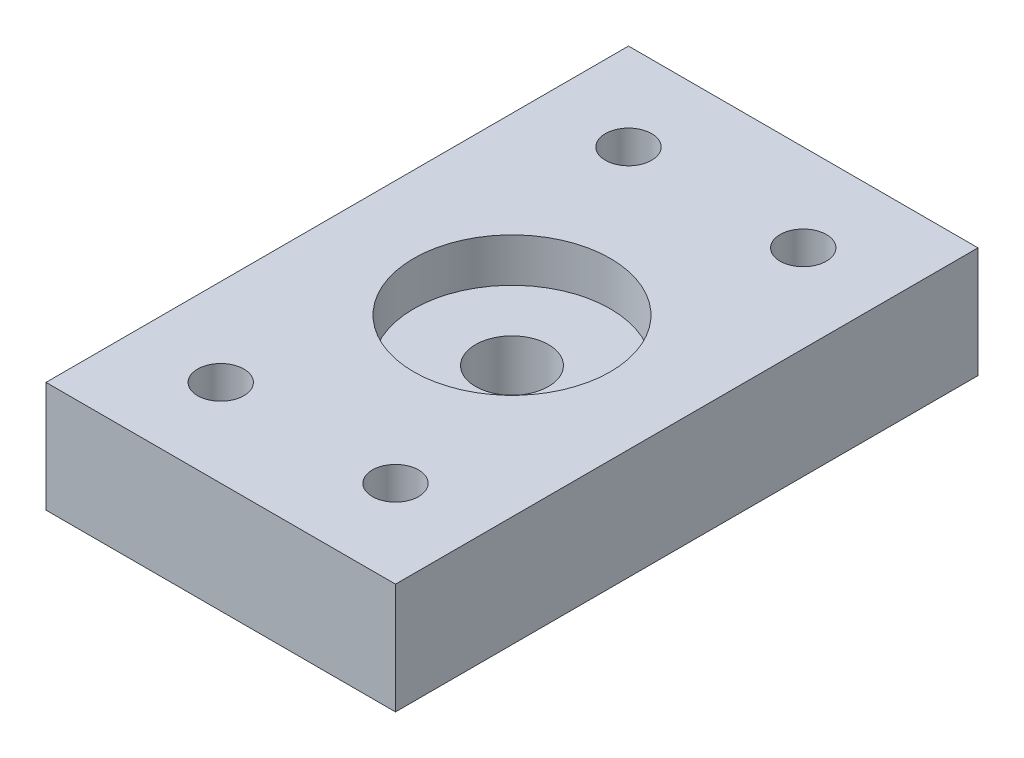
ISO-10303-21;
HEADER;
FILE_DESCRIPTION(('STEP AP214'),'2;1');
FILE_NAME('part.step','',(''),(''),'','','');
FILE_SCHEMA(('AUTOMOTIVE_DESIGN { 1 0 10303 214 1 1 1 1 }'));
ENDSEC;
DATA;
#1=APPLICATION_CONTEXT('core data for automotive mechanical design processes');
#2=APPLICATION_PROTOCOL_DEFINITION('international standard','automotive_design',2000,#1);
#3=PRODUCT_CONTEXT('',#1,'mechanical');
#4=PRODUCT('Part','Part','',(#3));
#5=PRODUCT_RELATED_PRODUCT_CATEGORY('part','',(#4));
#6=PRODUCT_DEFINITION_FORMATION('','',#4);
#7=PRODUCT_DEFINITION_CONTEXT('part definition',#1,'design');
#8=PRODUCT_DEFINITION('design','',#6,#7);
#9=PRODUCT_DEFINITION_SHAPE('','',#8);
#10=(LENGTH_UNIT() NAMED_UNIT(*) SI_UNIT(.MILLI.,.METRE.));
#11=(NAMED_UNIT(*) PLANE_ANGLE_UNIT() SI_UNIT($,.RADIAN.));
#12=(NAMED_UNIT(*) SI_UNIT($,.STERADIAN.) SOLID_ANGLE_UNIT());
#13=UNCERTAINTY_MEASURE_WITH_UNIT(LENGTH_MEASURE(1.E-05),#10,'distance_accuracy_value','');
#14=(GEOMETRIC_REPRESENTATION_CONTEXT(3) GLOBAL_UNCERTAINTY_ASSIGNED_CONTEXT((#13)) GLOBAL_UNIT_ASSIGNED_CONTEXT((#10,
#11,#12)) REPRESENTATION_CONTEXT('',''));
#15=CARTESIAN_POINT('',(0.,0.,0.));
#16=DIRECTION('',(0.,0.,1.));
#17=DIRECTION('',(1.,0.,0.));
#18=AXIS2_PLACEMENT_3D('',#15,#16,#17);
#19=CARTESIAN_POINT('',(0.,0.,0.));
#20=DIRECTION('',(0.,1.,0.));
#21=DIRECTION('',(0.,0.,1.));
#22=AXIS2_PLACEMENT_3D('',#19,#20,#21);
#23=CYLINDRICAL_SURFACE('',#22,7.9375);
#24=CARTESIAN_POINT('',(0.,0.,0.));
#25=DIRECTION('',(0.,1.,0.));
#26=DIRECTION('',(0.,0.,1.));
#27=AXIS2_PLACEMENT_3D('',#24,#25,#26);
#28=CIRCLE('',#27,7.9375);
#29=CARTESIAN_POINT('',(0.,0.,7.9375));
#30=VERTEX_POINT('',#29);
#31=EDGE_CURVE('E114',#30,#30,#28,.T.);
#32=CARTESIAN_POINT('',(0.,14.605,0.));
#33=DIRECTION('',(0.,1.,0.));
#34=DIRECTION('',(0.,0.,1.));
#35=AXIS2_PLACEMENT_3D('',#32,#33,#34);
#36=CIRCLE('',#35,7.9375);
#37=CARTESIAN_POINT('',(0.,14.605,7.9375));
#38=VERTEX_POINT('',#37);
#39=EDGE_CURVE('E43',#38,#38,#36,.F.);
#40=CARTESIAN_POINT('',(0.,0.,7.9375));
#41=CARTESIAN_POINT('',(0.,0.152135416666666,7.9375));
#42=CARTESIAN_POINT('',(0.,0.304270833333333,7.9375));
#43=CARTESIAN_POINT('',(0.,0.608541666666667,7.9375));
#44=CARTESIAN_POINT('',(0.,0.760677083333333,7.9375));
#45=CARTESIAN_POINT('',(0.,1.06494791666667,7.9375));
#46=CARTESIAN_POINT('',(0.,1.21708333333333,7.9375));
#47=CARTESIAN_POINT('',(0.,1.52135416666667,7.9375));
#48=CARTESIAN_POINT('',(0.,1.67348958333333,7.9375));
#49=CARTESIAN_POINT('',(0.,1.97776041666667,7.9375));
#50=CARTESIAN_POINT('',(0.,2.12989583333333,7.9375));
#51=CARTESIAN_POINT('',(0.,2.43416666666667,7.9375));
#52=CARTESIAN_POINT('',(0.,2.58630208333333,7.9375));
#53=CARTESIAN_POINT('',(0.,2.89057291666667,7.9375));
#54=CARTESIAN_POINT('',(0.,3.04270833333333,7.9375));
#55=CARTESIAN_POINT('',(0.,3.34697916666667,7.9375));
#56=CARTESIAN_POINT('',(0.,3.49911458333333,7.9375));
#57=CARTESIAN_POINT('',(0.,3.80338541666667,7.9375));
#58=CARTESIAN_POINT('',(0.,3.95552083333333,7.9375));
#59=CARTESIAN_POINT('',(0.,4.25979166666667,7.9375));
#60=CARTESIAN_POINT('',(0.,4.41192708333333,7.9375));
#61=CARTESIAN_POINT('',(0.,4.71619791666667,7.9375));
#62=CARTESIAN_POINT('',(0.,4.86833333333333,7.9375));
#63=CARTESIAN_POINT('',(0.,5.17260416666667,7.9375));
#64=CARTESIAN_POINT('',(0.,5.32473958333333,7.9375));
#65=CARTESIAN_POINT('',(0.,5.62901041666667,7.9375));
#66=CARTESIAN_POINT('',(0.,5.78114583333333,7.9375));
#67=CARTESIAN_POINT('',(0.,6.08541666666667,7.9375));
#68=CARTESIAN_POINT('',(0.,6.23755208333333,7.9375));
#69=CARTESIAN_POINT('',(0.,6.54182291666667,7.9375));
#70=CARTESIAN_POINT('',(0.,6.69395833333333,7.9375));
#71=CARTESIAN_POINT('',(0.,6.99822916666667,7.9375));
#72=CARTESIAN_POINT('',(0.,7.15036458333333,7.9375));
#73=CARTESIAN_POINT('',(0.,7.45463541666667,7.9375));
#74=CARTESIAN_POINT('',(0.,7.60677083333333,7.9375));
#75=CARTESIAN_POINT('',(0.,7.91104166666666,7.9375));
#76=CARTESIAN_POINT('',(0.,8.06317708333333,7.9375));
#77=CARTESIAN_POINT('',(0.,8.36744791666666,7.9375));
#78=CARTESIAN_POINT('',(0.,8.51958333333333,7.9375));
#79=CARTESIAN_POINT('',(0.,8.82385416666667,7.9375));
#80=CARTESIAN_POINT('',(0.,8.97598958333333,7.9375));
#81=CARTESIAN_POINT('',(0.,9.28026041666667,7.9375));
#82=CARTESIAN_POINT('',(0.,9.43239583333333,7.9375));
#83=CARTESIAN_POINT('',(0.,9.73666666666666,7.9375));
#84=CARTESIAN_POINT('',(0.,9.88880208333333,7.9375));
#85=CARTESIAN_POINT('',(0.,10.1930729166667,7.9375));
#86=CARTESIAN_POINT('',(0.,10.3452083333333,7.9375));
#87=CARTESIAN_POINT('',(0.,10.6494791666667,7.9375));
#88=CARTESIAN_POINT('',(0.,10.8016145833333,7.9375));
#89=CARTESIAN_POINT('',(0.,11.1058854166667,7.9375));
#90=CARTESIAN_POINT('',(0.,11.2580208333333,7.9375));
#91=CARTESIAN_POINT('',(0.,11.5622916666667,7.9375));
#92=CARTESIAN_POINT('',(0.,11.7144270833333,7.9375));
#93=CARTESIAN_POINT('',(0.,12.0186979166667,7.9375));
#94=CARTESIAN_POINT('',(0.,12.1708333333333,7.9375));
#95=CARTESIAN_POINT('',(0.,12.4751041666667,7.9375));
#96=CARTESIAN_POINT('',(0.,12.6272395833333,7.9375));
#97=CARTESIAN_POINT('',(0.,12.9315104166667,7.9375));
#98=CARTESIAN_POINT('',(0.,13.0836458333333,7.9375));
#99=CARTESIAN_POINT('',(0.,13.3879166666667,7.9375));
#100=CARTESIAN_POINT('',(0.,13.5400520833333,7.9375));
#101=CARTESIAN_POINT('',(0.,13.8443229166667,7.9375));
#102=CARTESIAN_POINT('',(0.,13.9964583333333,7.9375));
#103=CARTESIAN_POINT('',(0.,14.3007291666667,7.9375));
#104=CARTESIAN_POINT('',(0.,14.4528645833333,7.9375));
#105=CARTESIAN_POINT('',(0.,14.605,7.9375));
#106=B_SPLINE_CURVE_WITH_KNOTS('',3,(#40,#41,#42,#43,#44,#45,#46,#47,#48,#49,#50,#51,#52,#53,
#54,#55,#56,#57,#58,#59,#60,#61,#62,#63,#64,#65,#66,#67,#68,#69,#70,#71,#72,#73,#74,#75,#76,#77,
#78,#79,#80,#81,#82,#83,#84,#85,#86,#87,#88,#89,#90,#91,#92,#93,#94,#95,#96,#97,#98,#99,#100,
#101,#102,#103,#104,#105),.UNSPECIFIED.,.F.,.F.,(4,2,2,2,2,2,2,2,2,2,2,2,2,2,2,2,2,2,2,2,2,2,2,
2,2,2,2,2,2,2,2,2,4),(0.,0.45640625,0.9128125,1.36921875,1.825625,2.28203125,2.7384375,
3.19484375,3.65125,4.10765625,4.5640625,5.02046875,5.476875,5.93328125,6.3896875,6.84609375,
7.3025,7.75890625,8.2153125,8.67171875,9.128125,9.58453125,10.0409375,10.49734375,10.95375,
11.41015625,11.8665625,12.32296875,12.779375,13.23578125,13.6921875,14.14859375,14.605),.UNSPECIFIED.);
#107=EDGE_CURVE('BSEAM39',#30,#38,#106,.T.);
#108=ORIENTED_EDGE('',*,*,#31,.F.);
#109=ORIENTED_EDGE('',*,*,#39,.F.);
#110=ORIENTED_EDGE('',*,*,#107,.T.);
#111=ORIENTED_EDGE('',*,*,#107,.F.);
#112=EDGE_LOOP('',(#108,#110,#109,#111));
#113=FACE_BOUND('',#112,.T.);
#114=ADVANCED_FACE('F39',(#113),#23,.F.);
#115=CARTESIAN_POINT('',(38.1,24.13,63.5));
#116=DIRECTION('',(-1.,0.,0.));
#117=DIRECTION('',(0.,0.,1.));
#118=AXIS2_PLACEMENT_3D('',#115,#116,#117);
#119=PLANE('',#118);
#120=DIRECTION('',(0.,0.,-1.));
#121=VECTOR('',#120,1.);
#122=CARTESIAN_POINT('',(38.1,0.,63.5));
#123=LINE('',#122,#121);
#124=CARTESIAN_POINT('',(38.1,0.,63.5));
#125=VERTEX_POINT('',#124);
#126=CARTESIAN_POINT('',(38.1,0.,-63.5));
#127=VERTEX_POINT('',#126);
#128=EDGE_CURVE('E110',#125,#127,#123,.T.);
#129=ORIENTED_EDGE('',*,*,#128,.T.);
#130=DIRECTION('',(0.,-1.,0.));
#131=VECTOR('',#130,1.);
#132=CARTESIAN_POINT('',(38.1,24.13,-63.5));
#133=LINE('',#132,#131);
#134=CARTESIAN_POINT('',(38.1,24.13,-63.5));
#135=VERTEX_POINT('',#134);
#136=EDGE_CURVE('E11',#135,#127,#133,.T.);
#137=ORIENTED_EDGE('',*,*,#136,.F.);
#138=DIRECTION('',(0.,0.,-1.));
#139=VECTOR('',#138,1.);
#140=CARTESIAN_POINT('',(38.1,24.13,63.5));
#141=LINE('',#140,#139);
#142=CARTESIAN_POINT('',(38.1,24.13,63.5));
#143=VERTEX_POINT('',#142);
#144=EDGE_CURVE('E93',#143,#135,#141,.T.);
#145=ORIENTED_EDGE('',*,*,#144,.F.);
#146=DIRECTION('',(0.,-1.,0.));
#147=VECTOR('',#146,1.);
#148=CARTESIAN_POINT('',(38.1,24.13,63.5));
#149=LINE('',#148,#147);
#150=EDGE_CURVE('E106',#143,#125,#149,.T.);
#151=ORIENTED_EDGE('',*,*,#150,.T.);
#152=EDGE_LOOP('',(#129,#137,#145,#151));
#153=FACE_BOUND('',#152,.T.);
#154=ADVANCED_FACE('F41',(#153),#119,.F.);
#155=CARTESIAN_POINT('',(-38.1,24.13,-63.5));
#156=DIRECTION('',(0.,0.,1.));
#157=DIRECTION('',(1.,0.,0.));
#158=AXIS2_PLACEMENT_3D('',#155,#156,#157);
#159=PLANE('',#158);
#160=DIRECTION('',(-1.,0.,0.));
#161=VECTOR('',#160,1.);
#162=CARTESIAN_POINT('',(-38.1,0.,-63.5));
#163=LINE('',#162,#161);
#164=CARTESIAN_POINT('',(-38.1,0.,-63.5));
#165=VERTEX_POINT('',#164);
#166=EDGE_CURVE('E98',#127,#165,#163,.T.);
#167=ORIENTED_EDGE('',*,*,#166,.T.);
#168=DIRECTION('',(0.,-1.,0.));
#169=VECTOR('',#168,1.);
#170=CARTESIAN_POINT('',(-38.1,24.13,-63.5));
#171=LINE('',#170,#169);
#172=CARTESIAN_POINT('',(-38.1,24.13,-63.5));
#173=VERTEX_POINT('',#172);
#174=EDGE_CURVE('E50',#173,#165,#171,.T.);
#175=ORIENTED_EDGE('',*,*,#174,.F.);
#176=DIRECTION('',(-1.,0.,0.));
#177=VECTOR('',#176,1.);
#178=CARTESIAN_POINT('',(-38.1,24.13,-63.5));
#179=LINE('',#178,#177);
#180=EDGE_CURVE('E88',#135,#173,#179,.T.);
#181=ORIENTED_EDGE('',*,*,#180,.F.);
#182=ORIENTED_EDGE('',*,*,#136,.T.);
#183=EDGE_LOOP('',(#167,#175,#181,#182));
#184=FACE_BOUND('',#183,.T.);
#185=ADVANCED_FACE('F97',(#184),#159,.F.);
#186=CARTESIAN_POINT('',(-38.1,24.13,63.5));
#187=DIRECTION('',(1.,0.,0.));
#188=DIRECTION('',(0.,0.,-1.));
#189=AXIS2_PLACEMENT_3D('',#186,#187,#188);
#190=PLANE('',#189);
#191=DIRECTION('',(0.,0.,1.));
#192=VECTOR('',#191,1.);
#193=CARTESIAN_POINT('',(-38.1,0.,63.5));
#194=LINE('',#193,#192);
#195=CARTESIAN_POINT('',(-38.1,0.,63.5));
#196=VERTEX_POINT('',#195);
#197=EDGE_CURVE('E75',#165,#196,#194,.T.);
#198=ORIENTED_EDGE('',*,*,#197,.T.);
#199=DIRECTION('',(0.,-1.,0.));
#200=VECTOR('',#199,1.);
#201=CARTESIAN_POINT('',(-38.1,24.13,63.5));
#202=LINE('',#201,#200);
#203=CARTESIAN_POINT('',(-38.1,24.13,63.5));
#204=VERTEX_POINT('',#203);
#205=EDGE_CURVE('E100',#204,#196,#202,.T.);
#206=ORIENTED_EDGE('',*,*,#205,.F.);
#207=DIRECTION('',(0.,0.,1.));
#208=VECTOR('',#207,1.);
#209=CARTESIAN_POINT('',(-38.1,24.13,63.5));
#210=LINE('',#209,#208);
#211=EDGE_CURVE('E91',#173,#204,#210,.T.);
#212=ORIENTED_EDGE('',*,*,#211,.F.);
#213=ORIENTED_EDGE('',*,*,#174,.T.);
#214=EDGE_LOOP('',(#198,#206,#212,#213));
#215=FACE_BOUND('',#214,.T.);
#216=ADVANCED_FACE('F102',(#215),#190,.F.);
#217=CARTESIAN_POINT('',(-38.1,24.13,63.5));
#218=DIRECTION('',(0.,0.,-1.));
#219=DIRECTION('',(-1.,0.,0.));
#220=AXIS2_PLACEMENT_3D('',#217,#218,#219);
#221=PLANE('',#220);
#222=DIRECTION('',(1.,0.,0.));
#223=VECTOR('',#222,1.);
#224=CARTESIAN_POINT('',(-38.1,0.,63.5));
#225=LINE('',#224,#223);
#226=EDGE_CURVE('E81',#196,#125,#225,.T.);
#227=ORIENTED_EDGE('',*,*,#226,.T.);
#228=ORIENTED_EDGE('',*,*,#150,.F.);
#229=DIRECTION('',(1.,0.,0.));
#230=VECTOR('',#229,1.);
#231=CARTESIAN_POINT('',(-38.1,24.13,63.5));
#232=LINE('',#231,#230);
#233=EDGE_CURVE('E58',#204,#143,#232,.T.);
#234=ORIENTED_EDGE('',*,*,#233,.F.);
#235=ORIENTED_EDGE('',*,*,#205,.T.);
#236=EDGE_LOOP('',(#227,#228,#234,#235));
#237=FACE_BOUND('',#236,.T.);
#238=ADVANCED_FACE('F124',(#237),#221,.F.);
#239=CARTESIAN_POINT('',(0.,24.13,0.));
#240=DIRECTION('',(0.,-1.,0.));
#241=DIRECTION('',(0.,0.,-1.));
#242=AXIS2_PLACEMENT_3D('',#239,#240,#241);
#243=PLANE('',#242);
#244=CARTESIAN_POINT('',(0.,24.13,0.));
#245=DIRECTION('',(0.,1.,0.));
#246=DIRECTION('',(0.,0.,1.));
#247=AXIS2_PLACEMENT_3D('',#244,#245,#246);
#248=CIRCLE('',#247,21.43125);
#249=CARTESIAN_POINT('',(0.,24.13,21.43125));
#250=VERTEX_POINT('',#249);
#251=EDGE_CURVE('E166',#250,#250,#248,.T.);
#252=ORIENTED_EDGE('',*,*,#251,.F.);
#253=EDGE_LOOP('',(#252));
#254=FACE_BOUND('',#253,.T.);
#255=CARTESIAN_POINT('',(-19.05,24.13,44.45));
#256=DIRECTION('',(0.,1.,0.));
#257=DIRECTION('',(0.,0.,1.));
#258=AXIS2_PLACEMENT_3D('',#255,#256,#257);
#259=CIRCLE('',#258,5.0419);
#260=CARTESIAN_POINT('',(-19.05,24.13,49.4919));
#261=VERTEX_POINT('',#260);
#262=EDGE_CURVE('E159',#261,#261,#259,.T.);
#263=ORIENTED_EDGE('',*,*,#262,.F.);
#264=EDGE_LOOP('',(#263));
#265=FACE_BOUND('',#264,.T.);
#266=CARTESIAN_POINT('',(19.05,24.13,44.45));
#267=DIRECTION('',(0.,1.,0.));
#268=DIRECTION('',(0.,0.,1.));
#269=AXIS2_PLACEMENT_3D('',#266,#267,#268);
#270=CIRCLE('',#269,5.0419);
#271=CARTESIAN_POINT('',(19.05,24.13,49.4919));
#272=VERTEX_POINT('',#271);
#273=EDGE_CURVE('E151',#272,#272,#270,.T.);
#274=ORIENTED_EDGE('',*,*,#273,.F.);
#275=EDGE_LOOP('',(#274));
#276=FACE_BOUND('',#275,.T.);
#277=CARTESIAN_POINT('',(19.05,24.13,-44.45));
#278=DIRECTION('',(0.,1.,0.));
#279=DIRECTION('',(0.,0.,1.));
#280=AXIS2_PLACEMENT_3D('',#277,#278,#279);
#281=CIRCLE('',#280,5.0419);
#282=CARTESIAN_POINT('',(19.05,24.13,-39.4081));
#283=VERTEX_POINT('',#282);
#284=EDGE_CURVE('E143',#283,#283,#281,.T.);
#285=ORIENTED_EDGE('',*,*,#284,.F.);
#286=EDGE_LOOP('',(#285));
#287=FACE_BOUND('',#286,.T.);
#288=CARTESIAN_POINT('',(-19.05,24.13,-44.45));
#289=DIRECTION('',(0.,1.,0.));
#290=DIRECTION('',(0.,0.,1.));
#291=AXIS2_PLACEMENT_3D('',#288,#289,#290);
#292=CIRCLE('',#291,5.0419);
#293=CARTESIAN_POINT('',(-19.05,24.13,-39.4081));
#294=VERTEX_POINT('',#293);
#295=EDGE_CURVE('E135',#294,#294,#292,.T.);
#296=ORIENTED_EDGE('',*,*,#295,.F.);
#297=EDGE_LOOP('',(#296));
#298=FACE_BOUND('',#297,.T.);
#299=ORIENTED_EDGE('',*,*,#144,.T.);
#300=ORIENTED_EDGE('',*,*,#180,.T.);
#301=ORIENTED_EDGE('',*,*,#211,.T.);
#302=ORIENTED_EDGE('',*,*,#233,.T.);
#303=EDGE_LOOP('',(#299,#300,#301,#302));
#304=FACE_BOUND('',#303,.T.);
#305=ADVANCED_FACE('F89',(#254,#265,#276,#287,#298,#304),#243,.F.);
#306=CARTESIAN_POINT('',(0.,0.,0.));
#307=DIRECTION('',(0.,-1.,0.));
#308=DIRECTION('',(0.,0.,-1.));
#309=AXIS2_PLACEMENT_3D('',#306,#307,#308);
#310=PLANE('',#309);
#311=CARTESIAN_POINT('',(-19.05,0.,44.45));
#312=DIRECTION('',(0.,1.,0.));
#313=DIRECTION('',(0.,0.,1.));
#314=AXIS2_PLACEMENT_3D('',#311,#312,#313);
#315=CIRCLE('',#314,5.0419);
#316=CARTESIAN_POINT('',(-19.05,0.,49.4919));
#317=VERTEX_POINT('',#316);
#318=EDGE_CURVE('E155',#317,#317,#315,.T.);
#319=ORIENTED_EDGE('',*,*,#318,.T.);
#320=EDGE_LOOP('',(#319));
#321=FACE_BOUND('',#320,.T.);
#322=CARTESIAN_POINT('',(19.05,0.,44.45));
#323=DIRECTION('',(0.,1.,0.));
#324=DIRECTION('',(0.,0.,1.));
#325=AXIS2_PLACEMENT_3D('',#322,#323,#324);
#326=CIRCLE('',#325,5.0419);
#327=CARTESIAN_POINT('',(19.05,0.,49.4919));
#328=VERTEX_POINT('',#327);
#329=EDGE_CURVE('E147',#328,#328,#326,.T.);
#330=ORIENTED_EDGE('',*,*,#329,.T.);
#331=EDGE_LOOP('',(#330));
#332=FACE_BOUND('',#331,.T.);
#333=CARTESIAN_POINT('',(19.05,0.,-44.45));
#334=DIRECTION('',(0.,1.,0.));
#335=DIRECTION('',(0.,0.,1.));
#336=AXIS2_PLACEMENT_3D('',#333,#334,#335);
#337=CIRCLE('',#336,5.0419);
#338=CARTESIAN_POINT('',(19.05,0.,-39.4081));
#339=VERTEX_POINT('',#338);
#340=EDGE_CURVE('E139',#339,#339,#337,.T.);
#341=ORIENTED_EDGE('',*,*,#340,.T.);
#342=EDGE_LOOP('',(#341));
#343=FACE_BOUND('',#342,.T.);
#344=CARTESIAN_POINT('',(-19.05,0.,-44.45));
#345=DIRECTION('',(0.,1.,0.));
#346=DIRECTION('',(0.,0.,1.));
#347=AXIS2_PLACEMENT_3D('',#344,#345,#346);
#348=CIRCLE('',#347,5.0419);
#349=CARTESIAN_POINT('',(-19.05,0.,-39.4081));
#350=VERTEX_POINT('',#349);
#351=EDGE_CURVE('E134',#350,#350,#348,.T.);
#352=ORIENTED_EDGE('',*,*,#351,.T.);
#353=EDGE_LOOP('',(#352));
#354=FACE_BOUND('',#353,.T.);
#355=ORIENTED_EDGE('',*,*,#31,.T.);
#356=EDGE_LOOP('',(#355));
#357=FACE_BOUND('',#356,.T.);
#358=ORIENTED_EDGE('',*,*,#128,.F.);
#359=ORIENTED_EDGE('',*,*,#226,.F.);
#360=ORIENTED_EDGE('',*,*,#197,.F.);
#361=ORIENTED_EDGE('',*,*,#166,.F.);
#362=EDGE_LOOP('',(#358,#359,#360,#361));
#363=FACE_BOUND('',#362,.T.);
#364=ADVANCED_FACE('F127',(#321,#332,#343,#354,#357,#363),#310,.T.);
#365=CARTESIAN_POINT('',(-19.05,0.,-44.45));
#366=DIRECTION('',(0.,1.,0.));
#367=DIRECTION('',(0.,0.,1.));
#368=AXIS2_PLACEMENT_3D('',#365,#366,#367);
#369=CYLINDRICAL_SURFACE('',#368,5.0419);
#370=CARTESIAN_POINT('',(-19.05,0.,-39.4081));
#371=CARTESIAN_POINT('',(-19.05,0.251354166666666,-39.4081));
#372=CARTESIAN_POINT('',(-19.05,0.502708333333333,-39.4081));
#373=CARTESIAN_POINT('',(-19.05,1.00541666666667,-39.4081));
#374=CARTESIAN_POINT('',(-19.05,1.25677083333333,-39.4081));
#375=CARTESIAN_POINT('',(-19.05,1.75947916666667,-39.4081));
#376=CARTESIAN_POINT('',(-19.05,2.01083333333333,-39.4081));
#377=CARTESIAN_POINT('',(-19.05,2.51354166666667,-39.4081));
#378=CARTESIAN_POINT('',(-19.05,2.76489583333333,-39.4081));
#379=CARTESIAN_POINT('',(-19.05,3.26760416666667,-39.4081));
#380=CARTESIAN_POINT('',(-19.05,3.51895833333333,-39.4081));
#381=CARTESIAN_POINT('',(-19.05,4.02166666666667,-39.4081));
#382=CARTESIAN_POINT('',(-19.05,4.27302083333333,-39.4081));
#383=CARTESIAN_POINT('',(-19.05,4.77572916666667,-39.4081));
#384=CARTESIAN_POINT('',(-19.05,5.02708333333333,-39.4081));
#385=CARTESIAN_POINT('',(-19.05,5.52979166666667,-39.4081));
#386=CARTESIAN_POINT('',(-19.05,5.78114583333333,-39.4081));
#387=CARTESIAN_POINT('',(-19.05,6.28385416666667,-39.4081));
#388=CARTESIAN_POINT('',(-19.05,6.53520833333333,-39.4081));
#389=CARTESIAN_POINT('',(-19.05,7.03791666666667,-39.4081));
#390=CARTESIAN_POINT('',(-19.05,7.28927083333333,-39.4081));
#391=CARTESIAN_POINT('',(-19.05,7.79197916666666,-39.4081));
#392=CARTESIAN_POINT('',(-19.05,8.04333333333333,-39.4081));
#393=CARTESIAN_POINT('',(-19.05,8.54604166666667,-39.4081));
#394=CARTESIAN_POINT('',(-19.05,8.79739583333333,-39.4081));
#395=CARTESIAN_POINT('',(-19.05,9.30010416666667,-39.4081));
#396=CARTESIAN_POINT('',(-19.05,9.55145833333333,-39.4081));
#397=CARTESIAN_POINT('',(-19.05,10.0541666666667,-39.4081));
#398=CARTESIAN_POINT('',(-19.05,10.3055208333333,-39.4081));
#399=CARTESIAN_POINT('',(-19.05,10.8082291666667,-39.4081));
#400=CARTESIAN_POINT('',(-19.05,11.0595833333333,-39.4081));
#401=CARTESIAN_POINT('',(-19.05,11.5622916666667,-39.4081));
#402=CARTESIAN_POINT('',(-19.05,11.8136458333333,-39.4081));
#403=CARTESIAN_POINT('',(-19.05,12.3163541666667,-39.4081));
#404=CARTESIAN_POINT('',(-19.05,12.5677083333333,-39.4081));
#405=CARTESIAN_POINT('',(-19.05,13.0704166666667,-39.4081));
#406=CARTESIAN_POINT('',(-19.05,13.3217708333333,-39.4081));
#407=CARTESIAN_POINT('',(-19.05,13.8244791666667,-39.4081));
#408=CARTESIAN_POINT('',(-19.05,14.0758333333333,-39.4081));
#409=CARTESIAN_POINT('',(-19.05,14.5785416666667,-39.4081));
#410=CARTESIAN_POINT('',(-19.05,14.8298958333333,-39.4081));
#411=CARTESIAN_POINT('',(-19.05,15.3326041666667,-39.4081));
#412=CARTESIAN_POINT('',(-19.05,15.5839583333333,-39.4081));
#413=CARTESIAN_POINT('',(-19.05,16.0866666666667,-39.4081));
#414=CARTESIAN_POINT('',(-19.05,16.3380208333333,-39.4081));
#415=CARTESIAN_POINT('',(-19.05,16.8407291666667,-39.4081));
#416=CARTESIAN_POINT('',(-19.05,17.0920833333333,-39.4081));
#417=CARTESIAN_POINT('',(-19.05,17.5947916666667,-39.4081));
#418=CARTESIAN_POINT('',(-19.05,17.8461458333333,-39.4081));
#419=CARTESIAN_POINT('',(-19.05,18.3488541666667,-39.4081));
#420=CARTESIAN_POINT('',(-19.05,18.6002083333333,-39.4081));
#421=CARTESIAN_POINT('',(-19.05,19.1029166666667,-39.4081));
#422=CARTESIAN_POINT('',(-19.05,19.3542708333333,-39.4081));
#423=CARTESIAN_POINT('',(-19.05,19.8569791666667,-39.4081));
#424=CARTESIAN_POINT('',(-19.05,20.1083333333333,-39.4081));
#425=CARTESIAN_POINT('',(-19.05,20.6110416666667,-39.4081));
#426=CARTESIAN_POINT('',(-19.05,20.8623958333333,-39.4081));
#427=CARTESIAN_POINT('',(-19.05,21.3651041666667,-39.4081));
#428=CARTESIAN_POINT('',(-19.05,21.6164583333333,-39.4081));
#429=CARTESIAN_POINT('',(-19.05,22.1191666666667,-39.4081));
#430=CARTESIAN_POINT('',(-19.05,22.3705208333333,-39.4081));
#431=CARTESIAN_POINT('',(-19.05,22.8732291666667,-39.4081));
#432=CARTESIAN_POINT('',(-19.05,23.1245833333333,-39.4081));
#433=CARTESIAN_POINT('',(-19.05,23.6272916666667,-39.4081));
#434=CARTESIAN_POINT('',(-19.05,23.8786458333333,-39.4081));
#435=CARTESIAN_POINT('',(-19.05,24.13,-39.4081));
#436=B_SPLINE_CURVE_WITH_KNOTS('',3,(#370,#371,#372,#373,#374,#375,#376,#377,#378,#379,#380,
#381,#382,#383,#384,#385,#386,#387,#388,#389,#390,#391,#392,#393,#394,#395,#396,#397,#398,#399,
#400,#401,#402,#403,#404,#405,#406,#407,#408,#409,#410,#411,#412,#413,#414,#415,#416,#417,#418,
#419,#420,#421,#422,#423,#424,#425,#426,#427,#428,#429,#430,#431,#432,#433,#434,#435),
.UNSPECIFIED.,.F.,.F.,(4,2,2,2,2,2,2,2,2,2,2,2,2,2,2,2,2,2,2,2,2,2,2,2,2,2,2,2,2,2,2,2,4),(0.,
0.7540625,1.508125,2.2621875,3.01625,3.7703125,4.524375,5.2784375,6.0325,6.7865625,7.540625,
8.2946875,9.04875,9.8028125,10.556875,11.3109375,12.065,12.8190625,13.573125,14.3271875,
15.08125,15.8353125,16.589375,17.3434375,18.0975,18.8515625,19.605625,20.3596875,21.11375,
21.8678125,22.621875,23.3759375,24.13),.UNSPECIFIED.);
#437=EDGE_CURVE('BSEAM192',#350,#294,#436,.T.);
#438=ORIENTED_EDGE('',*,*,#351,.F.);
#439=ORIENTED_EDGE('',*,*,#295,.T.);
#440=ORIENTED_EDGE('',*,*,#437,.T.);
#441=ORIENTED_EDGE('',*,*,#437,.F.);
#442=EDGE_LOOP('',(#438,#440,#439,#441));
#443=FACE_BOUND('',#442,.T.);
#444=ADVANCED_FACE('F192',(#443),#369,.F.);
#445=CARTESIAN_POINT('',(19.05,0.,-44.45));
#446=DIRECTION('',(0.,1.,0.));
#447=DIRECTION('',(0.,0.,1.));
#448=AXIS2_PLACEMENT_3D('',#445,#446,#447);
#449=CYLINDRICAL_SURFACE('',#448,5.0419);
#450=CARTESIAN_POINT('',(19.05,0.,-39.4081));
#451=CARTESIAN_POINT('',(19.05,0.251354166666666,-39.4081));
#452=CARTESIAN_POINT('',(19.05,0.502708333333333,-39.4081));
#453=CARTESIAN_POINT('',(19.05,1.00541666666667,-39.4081));
#454=CARTESIAN_POINT('',(19.05,1.25677083333333,-39.4081));
#455=CARTESIAN_POINT('',(19.05,1.75947916666667,-39.4081));
#456=CARTESIAN_POINT('',(19.05,2.01083333333333,-39.4081));
#457=CARTESIAN_POINT('',(19.05,2.51354166666667,-39.4081));
#458=CARTESIAN_POINT('',(19.05,2.76489583333333,-39.4081));
#459=CARTESIAN_POINT('',(19.05,3.26760416666667,-39.4081));
#460=CARTESIAN_POINT('',(19.05,3.51895833333333,-39.4081));
#461=CARTESIAN_POINT('',(19.05,4.02166666666667,-39.4081));
#462=CARTESIAN_POINT('',(19.05,4.27302083333333,-39.4081));
#463=CARTESIAN_POINT('',(19.05,4.77572916666667,-39.4081));
#464=CARTESIAN_POINT('',(19.05,5.02708333333333,-39.4081));
#465=CARTESIAN_POINT('',(19.05,5.52979166666667,-39.4081));
#466=CARTESIAN_POINT('',(19.05,5.78114583333333,-39.4081));
#467=CARTESIAN_POINT('',(19.05,6.28385416666667,-39.4081));
#468=CARTESIAN_POINT('',(19.05,6.53520833333333,-39.4081));
#469=CARTESIAN_POINT('',(19.05,7.03791666666667,-39.4081));
#470=CARTESIAN_POINT('',(19.05,7.28927083333333,-39.4081));
#471=CARTESIAN_POINT('',(19.05,7.79197916666666,-39.4081));
#472=CARTESIAN_POINT('',(19.05,8.04333333333333,-39.4081));
#473=CARTESIAN_POINT('',(19.05,8.54604166666667,-39.4081));
#474=CARTESIAN_POINT('',(19.05,8.79739583333333,-39.4081));
#475=CARTESIAN_POINT('',(19.05,9.30010416666667,-39.4081));
#476=CARTESIAN_POINT('',(19.05,9.55145833333333,-39.4081));
#477=CARTESIAN_POINT('',(19.05,10.0541666666667,-39.4081));
#478=CARTESIAN_POINT('',(19.05,10.3055208333333,-39.4081));
#479=CARTESIAN_POINT('',(19.05,10.8082291666667,-39.4081));
#480=CARTESIAN_POINT('',(19.05,11.0595833333333,-39.4081));
#481=CARTESIAN_POINT('',(19.05,11.5622916666667,-39.4081));
#482=CARTESIAN_POINT('',(19.05,11.8136458333333,-39.4081));
#483=CARTESIAN_POINT('',(19.05,12.3163541666667,-39.4081));
#484=CARTESIAN_POINT('',(19.05,12.5677083333333,-39.4081));
#485=CARTESIAN_POINT('',(19.05,13.0704166666667,-39.4081));
#486=CARTESIAN_POINT('',(19.05,13.3217708333333,-39.4081));
#487=CARTESIAN_POINT('',(19.05,13.8244791666667,-39.4081));
#488=CARTESIAN_POINT('',(19.05,14.0758333333333,-39.4081));
#489=CARTESIAN_POINT('',(19.05,14.5785416666667,-39.4081));
#490=CARTESIAN_POINT('',(19.05,14.8298958333333,-39.4081));
#491=CARTESIAN_POINT('',(19.05,15.3326041666667,-39.4081));
#492=CARTESIAN_POINT('',(19.05,15.5839583333333,-39.4081));
#493=CARTESIAN_POINT('',(19.05,16.0866666666667,-39.4081));
#494=CARTESIAN_POINT('',(19.05,16.3380208333333,-39.4081));
#495=CARTESIAN_POINT('',(19.05,16.8407291666667,-39.4081));
#496=CARTESIAN_POINT('',(19.05,17.0920833333333,-39.4081));
#497=CARTESIAN_POINT('',(19.05,17.5947916666667,-39.4081));
#498=CARTESIAN_POINT('',(19.05,17.8461458333333,-39.4081));
#499=CARTESIAN_POINT('',(19.05,18.3488541666667,-39.4081));
#500=CARTESIAN_POINT('',(19.05,18.6002083333333,-39.4081));
#501=CARTESIAN_POINT('',(19.05,19.1029166666667,-39.4081));
#502=CARTESIAN_POINT('',(19.05,19.3542708333333,-39.4081));
#503=CARTESIAN_POINT('',(19.05,19.8569791666667,-39.4081));
#504=CARTESIAN_POINT('',(19.05,20.1083333333333,-39.4081));
#505=CARTESIAN_POINT('',(19.05,20.6110416666667,-39.4081));
#506=CARTESIAN_POINT('',(19.05,20.8623958333333,-39.4081));
#507=CARTESIAN_POINT('',(19.05,21.3651041666667,-39.4081));
#508=CARTESIAN_POINT('',(19.05,21.6164583333333,-39.4081));
#509=CARTESIAN_POINT('',(19.05,22.1191666666667,-39.4081));
#510=CARTESIAN_POINT('',(19.05,22.3705208333333,-39.4081));
#511=CARTESIAN_POINT('',(19.05,22.8732291666667,-39.4081));
#512=CARTESIAN_POINT('',(19.05,23.1245833333333,-39.4081));
#513=CARTESIAN_POINT('',(19.05,23.6272916666667,-39.4081));
#514=CARTESIAN_POINT('',(19.05,23.8786458333333,-39.4081));
#515=CARTESIAN_POINT('',(19.05,24.13,-39.4081));
#516=B_SPLINE_CURVE_WITH_KNOTS('',3,(#450,#451,#452,#453,#454,#455,#456,#457,#458,#459,#460,
#461,#462,#463,#464,#465,#466,#467,#468,#469,#470,#471,#472,#473,#474,#475,#476,#477,#478,#479,
#480,#481,#482,#483,#484,#485,#486,#487,#488,#489,#490,#491,#492,#493,#494,#495,#496,#497,#498,
#499,#500,#501,#502,#503,#504,#505,#506,#507,#508,#509,#510,#511,#512,#513,#514,#515),
.UNSPECIFIED.,.F.,.F.,(4,2,2,2,2,2,2,2,2,2,2,2,2,2,2,2,2,2,2,2,2,2,2,2,2,2,2,2,2,2,2,2,4),(0.,
0.7540625,1.508125,2.2621875,3.01625,3.7703125,4.524375,5.2784375,6.0325,6.7865625,7.540625,
8.2946875,9.04875,9.8028125,10.556875,11.3109375,12.065,12.8190625,13.573125,14.3271875,
15.08125,15.8353125,16.589375,17.3434375,18.0975,18.8515625,19.605625,20.3596875,21.11375,
21.8678125,22.621875,23.3759375,24.13),.UNSPECIFIED.);
#517=EDGE_CURVE('BSEAM232',#339,#283,#516,.T.);
#518=ORIENTED_EDGE('',*,*,#340,.F.);
#519=ORIENTED_EDGE('',*,*,#284,.T.);
#520=ORIENTED_EDGE('',*,*,#517,.T.);
#521=ORIENTED_EDGE('',*,*,#517,.F.);
#522=EDGE_LOOP('',(#518,#520,#519,#521));
#523=FACE_BOUND('',#522,.T.);
#524=ADVANCED_FACE('F232',(#523),#449,.F.);
#525=CARTESIAN_POINT('',(19.05,0.,44.45));
#526=DIRECTION('',(0.,1.,0.));
#527=DIRECTION('',(0.,0.,1.));
#528=AXIS2_PLACEMENT_3D('',#525,#526,#527);
#529=CYLINDRICAL_SURFACE('',#528,5.0419);
#530=CARTESIAN_POINT('',(19.05,0.,49.4919));
#531=CARTESIAN_POINT('',(19.05,0.251354166666666,49.4919));
#532=CARTESIAN_POINT('',(19.05,0.502708333333333,49.4919));
#533=CARTESIAN_POINT('',(19.05,1.00541666666667,49.4919));
#534=CARTESIAN_POINT('',(19.05,1.25677083333333,49.4919));
#535=CARTESIAN_POINT('',(19.05,1.75947916666667,49.4919));
#536=CARTESIAN_POINT('',(19.05,2.01083333333333,49.4919));
#537=CARTESIAN_POINT('',(19.05,2.51354166666667,49.4919));
#538=CARTESIAN_POINT('',(19.05,2.76489583333333,49.4919));
#539=CARTESIAN_POINT('',(19.05,3.26760416666667,49.4919));
#540=CARTESIAN_POINT('',(19.05,3.51895833333333,49.4919));
#541=CARTESIAN_POINT('',(19.05,4.02166666666667,49.4919));
#542=CARTESIAN_POINT('',(19.05,4.27302083333333,49.4919));
#543=CARTESIAN_POINT('',(19.05,4.77572916666667,49.4919));
#544=CARTESIAN_POINT('',(19.05,5.02708333333333,49.4919));
#545=CARTESIAN_POINT('',(19.05,5.52979166666667,49.4919));
#546=CARTESIAN_POINT('',(19.05,5.78114583333333,49.4919));
#547=CARTESIAN_POINT('',(19.05,6.28385416666667,49.4919));
#548=CARTESIAN_POINT('',(19.05,6.53520833333333,49.4919));
#549=CARTESIAN_POINT('',(19.05,7.03791666666667,49.4919));
#550=CARTESIAN_POINT('',(19.05,7.28927083333333,49.4919));
#551=CARTESIAN_POINT('',(19.05,7.79197916666666,49.4919));
#552=CARTESIAN_POINT('',(19.05,8.04333333333333,49.4919));
#553=CARTESIAN_POINT('',(19.05,8.54604166666667,49.4919));
#554=CARTESIAN_POINT('',(19.05,8.79739583333333,49.4919));
#555=CARTESIAN_POINT('',(19.05,9.30010416666667,49.4919));
#556=CARTESIAN_POINT('',(19.05,9.55145833333333,49.4919));
#557=CARTESIAN_POINT('',(19.05,10.0541666666667,49.4919));
#558=CARTESIAN_POINT('',(19.05,10.3055208333333,49.4919));
#559=CARTESIAN_POINT('',(19.05,10.8082291666667,49.4919));
#560=CARTESIAN_POINT('',(19.05,11.0595833333333,49.4919));
#561=CARTESIAN_POINT('',(19.05,11.5622916666667,49.4919));
#562=CARTESIAN_POINT('',(19.05,11.8136458333333,49.4919));
#563=CARTESIAN_POINT('',(19.05,12.3163541666667,49.4919));
#564=CARTESIAN_POINT('',(19.05,12.5677083333333,49.4919));
#565=CARTESIAN_POINT('',(19.05,13.0704166666667,49.4919));
#566=CARTESIAN_POINT('',(19.05,13.3217708333333,49.4919));
#567=CARTESIAN_POINT('',(19.05,13.8244791666667,49.4919));
#568=CARTESIAN_POINT('',(19.05,14.0758333333333,49.4919));
#569=CARTESIAN_POINT('',(19.05,14.5785416666667,49.4919));
#570=CARTESIAN_POINT('',(19.05,14.8298958333333,49.4919));
#571=CARTESIAN_POINT('',(19.05,15.3326041666667,49.4919));
#572=CARTESIAN_POINT('',(19.05,15.5839583333333,49.4919));
#573=CARTESIAN_POINT('',(19.05,16.0866666666667,49.4919));
#574=CARTESIAN_POINT('',(19.05,16.3380208333333,49.4919));
#575=CARTESIAN_POINT('',(19.05,16.8407291666667,49.4919));
#576=CARTESIAN_POINT('',(19.05,17.0920833333333,49.4919));
#577=CARTESIAN_POINT('',(19.05,17.5947916666667,49.4919));
#578=CARTESIAN_POINT('',(19.05,17.8461458333333,49.4919));
#579=CARTESIAN_POINT('',(19.05,18.3488541666667,49.4919));
#580=CARTESIAN_POINT('',(19.05,18.6002083333333,49.4919));
#581=CARTESIAN_POINT('',(19.05,19.1029166666667,49.4919));
#582=CARTESIAN_POINT('',(19.05,19.3542708333333,49.4919));
#583=CARTESIAN_POINT('',(19.05,19.8569791666667,49.4919));
#584=CARTESIAN_POINT('',(19.05,20.1083333333333,49.4919));
#585=CARTESIAN_POINT('',(19.05,20.6110416666667,49.4919));
#586=CARTESIAN_POINT('',(19.05,20.8623958333333,49.4919));
#587=CARTESIAN_POINT('',(19.05,21.3651041666667,49.4919));
#588=CARTESIAN_POINT('',(19.05,21.6164583333333,49.4919));
#589=CARTESIAN_POINT('',(19.05,22.1191666666667,49.4919));
#590=CARTESIAN_POINT('',(19.05,22.3705208333333,49.4919));
#591=CARTESIAN_POINT('',(19.05,22.8732291666667,49.4919));
#592=CARTESIAN_POINT('',(19.05,23.1245833333333,49.4919));
#593=CARTESIAN_POINT('',(19.05,23.6272916666667,49.4919));
#594=CARTESIAN_POINT('',(19.05,23.8786458333333,49.4919));
#595=CARTESIAN_POINT('',(19.05,24.13,49.4919));
#596=B_SPLINE_CURVE_WITH_KNOTS('',3,(#530,#531,#532,#533,#534,#535,#536,#537,#538,#539,#540,
#541,#542,#543,#544,#545,#546,#547,#548,#549,#550,#551,#552,#553,#554,#555,#556,#557,#558,#559,
#560,#561,#562,#563,#564,#565,#566,#567,#568,#569,#570,#571,#572,#573,#574,#575,#576,#577,#578,
#579,#580,#581,#582,#583,#584,#585,#586,#587,#588,#589,#590,#591,#592,#593,#594,#595),
.UNSPECIFIED.,.F.,.F.,(4,2,2,2,2,2,2,2,2,2,2,2,2,2,2,2,2,2,2,2,2,2,2,2,2,2,2,2,2,2,2,2,4),(0.,
0.7540625,1.508125,2.2621875,3.01625,3.7703125,4.524375,5.2784375,6.0325,6.7865625,7.540625,
8.2946875,9.04875,9.8028125,10.556875,11.3109375,12.065,12.8190625,13.573125,14.3271875,
15.08125,15.8353125,16.589375,17.3434375,18.0975,18.8515625,19.605625,20.3596875,21.11375,
21.8678125,22.621875,23.3759375,24.13),.UNSPECIFIED.);
#597=EDGE_CURVE('BSEAM239',#328,#272,#596,.T.);
#598=ORIENTED_EDGE('',*,*,#329,.F.);
#599=ORIENTED_EDGE('',*,*,#273,.T.);
#600=ORIENTED_EDGE('',*,*,#597,.T.);
#601=ORIENTED_EDGE('',*,*,#597,.F.);
#602=EDGE_LOOP('',(#598,#600,#599,#601));
#603=FACE_BOUND('',#602,.T.);
#604=ADVANCED_FACE('F239',(#603),#529,.F.);
#605=CARTESIAN_POINT('',(-19.05,0.,44.45));
#606=DIRECTION('',(0.,1.,0.));
#607=DIRECTION('',(0.,0.,1.));
#608=AXIS2_PLACEMENT_3D('',#605,#606,#607);
#609=CYLINDRICAL_SURFACE('',#608,5.0419);
#610=CARTESIAN_POINT('',(-19.05,0.,49.4919));
#611=CARTESIAN_POINT('',(-19.05,0.251354166666666,49.4919));
#612=CARTESIAN_POINT('',(-19.05,0.502708333333333,49.4919));
#613=CARTESIAN_POINT('',(-19.05,1.00541666666667,49.4919));
#614=CARTESIAN_POINT('',(-19.05,1.25677083333333,49.4919));
#615=CARTESIAN_POINT('',(-19.05,1.75947916666667,49.4919));
#616=CARTESIAN_POINT('',(-19.05,2.01083333333333,49.4919));
#617=CARTESIAN_POINT('',(-19.05,2.51354166666667,49.4919));
#618=CARTESIAN_POINT('',(-19.05,2.76489583333333,49.4919));
#619=CARTESIAN_POINT('',(-19.05,3.26760416666667,49.4919));
#620=CARTESIAN_POINT('',(-19.05,3.51895833333333,49.4919));
#621=CARTESIAN_POINT('',(-19.05,4.02166666666667,49.4919));
#622=CARTESIAN_POINT('',(-19.05,4.27302083333333,49.4919));
#623=CARTESIAN_POINT('',(-19.05,4.77572916666667,49.4919));
#624=CARTESIAN_POINT('',(-19.05,5.02708333333333,49.4919));
#625=CARTESIAN_POINT('',(-19.05,5.52979166666667,49.4919));
#626=CARTESIAN_POINT('',(-19.05,5.78114583333333,49.4919));
#627=CARTESIAN_POINT('',(-19.05,6.28385416666667,49.4919));
#628=CARTESIAN_POINT('',(-19.05,6.53520833333333,49.4919));
#629=CARTESIAN_POINT('',(-19.05,7.03791666666667,49.4919));
#630=CARTESIAN_POINT('',(-19.05,7.28927083333333,49.4919));
#631=CARTESIAN_POINT('',(-19.05,7.79197916666666,49.4919));
#632=CARTESIAN_POINT('',(-19.05,8.04333333333333,49.4919));
#633=CARTESIAN_POINT('',(-19.05,8.54604166666667,49.4919));
#634=CARTESIAN_POINT('',(-19.05,8.79739583333333,49.4919));
#635=CARTESIAN_POINT('',(-19.05,9.30010416666667,49.4919));
#636=CARTESIAN_POINT('',(-19.05,9.55145833333333,49.4919));
#637=CARTESIAN_POINT('',(-19.05,10.0541666666667,49.4919));
#638=CARTESIAN_POINT('',(-19.05,10.3055208333333,49.4919));
#639=CARTESIAN_POINT('',(-19.05,10.8082291666667,49.4919));
#640=CARTESIAN_POINT('',(-19.05,11.0595833333333,49.4919));
#641=CARTESIAN_POINT('',(-19.05,11.5622916666667,49.4919));
#642=CARTESIAN_POINT('',(-19.05,11.8136458333333,49.4919));
#643=CARTESIAN_POINT('',(-19.05,12.3163541666667,49.4919));
#644=CARTESIAN_POINT('',(-19.05,12.5677083333333,49.4919));
#645=CARTESIAN_POINT('',(-19.05,13.0704166666667,49.4919));
#646=CARTESIAN_POINT('',(-19.05,13.3217708333333,49.4919));
#647=CARTESIAN_POINT('',(-19.05,13.8244791666667,49.4919));
#648=CARTESIAN_POINT('',(-19.05,14.0758333333333,49.4919));
#649=CARTESIAN_POINT('',(-19.05,14.5785416666667,49.4919));
#650=CARTESIAN_POINT('',(-19.05,14.8298958333333,49.4919));
#651=CARTESIAN_POINT('',(-19.05,15.3326041666667,49.4919));
#652=CARTESIAN_POINT('',(-19.05,15.5839583333333,49.4919));
#653=CARTESIAN_POINT('',(-19.05,16.0866666666667,49.4919));
#654=CARTESIAN_POINT('',(-19.05,16.3380208333333,49.4919));
#655=CARTESIAN_POINT('',(-19.05,16.8407291666667,49.4919));
#656=CARTESIAN_POINT('',(-19.05,17.0920833333333,49.4919));
#657=CARTESIAN_POINT('',(-19.05,17.5947916666667,49.4919));
#658=CARTESIAN_POINT('',(-19.05,17.8461458333333,49.4919));
#659=CARTESIAN_POINT('',(-19.05,18.3488541666667,49.4919));
#660=CARTESIAN_POINT('',(-19.05,18.6002083333333,49.4919));
#661=CARTESIAN_POINT('',(-19.05,19.1029166666667,49.4919));
#662=CARTESIAN_POINT('',(-19.05,19.3542708333333,49.4919));
#663=CARTESIAN_POINT('',(-19.05,19.8569791666667,49.4919));
#664=CARTESIAN_POINT('',(-19.05,20.1083333333333,49.4919));
#665=CARTESIAN_POINT('',(-19.05,20.6110416666667,49.4919));
#666=CARTESIAN_POINT('',(-19.05,20.8623958333333,49.4919));
#667=CARTESIAN_POINT('',(-19.05,21.3651041666667,49.4919));
#668=CARTESIAN_POINT('',(-19.05,21.6164583333333,49.4919));
#669=CARTESIAN_POINT('',(-19.05,22.1191666666667,49.4919));
#670=CARTESIAN_POINT('',(-19.05,22.3705208333333,49.4919));
#671=CARTESIAN_POINT('',(-19.05,22.8732291666667,49.4919));
#672=CARTESIAN_POINT('',(-19.05,23.1245833333333,49.4919));
#673=CARTESIAN_POINT('',(-19.05,23.6272916666667,49.4919));
#674=CARTESIAN_POINT('',(-19.05,23.8786458333333,49.4919));
#675=CARTESIAN_POINT('',(-19.05,24.13,49.4919));
#676=B_SPLINE_CURVE_WITH_KNOTS('',3,(#610,#611,#612,#613,#614,#615,#616,#617,#618,#619,#620,
#621,#622,#623,#624,#625,#626,#627,#628,#629,#630,#631,#632,#633,#634,#635,#636,#637,#638,#639,
#640,#641,#642,#643,#644,#645,#646,#647,#648,#649,#650,#651,#652,#653,#654,#655,#656,#657,#658,
#659,#660,#661,#662,#663,#664,#665,#666,#667,#668,#669,#670,#671,#672,#673,#674,#675),
.UNSPECIFIED.,.F.,.F.,(4,2,2,2,2,2,2,2,2,2,2,2,2,2,2,2,2,2,2,2,2,2,2,2,2,2,2,2,2,2,2,2,4),(0.,
0.7540625,1.508125,2.2621875,3.01625,3.7703125,4.524375,5.2784375,6.0325,6.7865625,7.540625,
8.2946875,9.04875,9.8028125,10.556875,11.3109375,12.065,12.8190625,13.573125,14.3271875,
15.08125,15.8353125,16.589375,17.3434375,18.0975,18.8515625,19.605625,20.3596875,21.11375,
21.8678125,22.621875,23.3759375,24.13),.UNSPECIFIED.);
#677=EDGE_CURVE('BSEAM246',#317,#261,#676,.T.);
#678=ORIENTED_EDGE('',*,*,#318,.F.);
#679=ORIENTED_EDGE('',*,*,#262,.T.);
#680=ORIENTED_EDGE('',*,*,#677,.T.);
#681=ORIENTED_EDGE('',*,*,#677,.F.);
#682=EDGE_LOOP('',(#678,#680,#679,#681));
#683=FACE_BOUND('',#682,.T.);
#684=ADVANCED_FACE('F246',(#683),#609,.F.);
#685=CARTESIAN_POINT('',(0.,14.605,0.));
#686=DIRECTION('',(0.,1.,0.));
#687=DIRECTION('',(0.,0.,1.));
#688=AXIS2_PLACEMENT_3D('',#685,#686,#687);
#689=PLANE('',#688);
#690=CARTESIAN_POINT('',(0.,14.605,0.));
#691=DIRECTION('',(0.,1.,0.));
#692=DIRECTION('',(0.,0.,1.));
#693=AXIS2_PLACEMENT_3D('',#690,#691,#692);
#694=CIRCLE('',#693,21.43125);
#695=CARTESIAN_POINT('',(0.,14.605,21.43125));
#696=VERTEX_POINT('',#695);
#697=EDGE_CURVE('E170',#696,#696,#694,.T.);
#698=ORIENTED_EDGE('',*,*,#697,.T.);
#699=EDGE_LOOP('',(#698));
#700=FACE_BOUND('',#699,.T.);
#701=ORIENTED_EDGE('',*,*,#39,.T.);
#702=EDGE_LOOP('',(#701));
#703=FACE_BOUND('',#702,.T.);
#704=ADVANCED_FACE('F179',(#700,#703),#689,.T.);
#705=CARTESIAN_POINT('',(0.,14.605,0.));
#706=DIRECTION('',(0.,1.,0.));
#707=DIRECTION('',(0.,0.,1.));
#708=AXIS2_PLACEMENT_3D('',#705,#706,#707);
#709=CYLINDRICAL_SURFACE('',#708,21.43125);
#710=CARTESIAN_POINT('',(0.,14.605,21.43125));
#711=CARTESIAN_POINT('',(0.,14.70421875,21.43125));
#712=CARTESIAN_POINT('',(0.,14.8034375,21.43125));
#713=CARTESIAN_POINT('',(0.,15.001875,21.43125));
#714=CARTESIAN_POINT('',(0.,15.10109375,21.43125));
#715=CARTESIAN_POINT('',(0.,15.29953125,21.43125));
#716=CARTESIAN_POINT('',(0.,15.39875,21.43125));
#717=CARTESIAN_POINT('',(0.,15.5971875,21.43125));
#718=CARTESIAN_POINT('',(0.,15.69640625,21.43125));
#719=CARTESIAN_POINT('',(0.,15.89484375,21.43125));
#720=CARTESIAN_POINT('',(0.,15.9940625,21.43125));
#721=CARTESIAN_POINT('',(0.,16.1925,21.43125));
#722=CARTESIAN_POINT('',(0.,16.29171875,21.43125));
#723=CARTESIAN_POINT('',(0.,16.49015625,21.43125));
#724=CARTESIAN_POINT('',(0.,16.589375,21.43125));
#725=CARTESIAN_POINT('',(0.,16.7878125,21.43125));
#726=CARTESIAN_POINT('',(0.,16.88703125,21.43125));
#727=CARTESIAN_POINT('',(0.,17.08546875,21.43125));
#728=CARTESIAN_POINT('',(0.,17.1846875,21.43125));
#729=CARTESIAN_POINT('',(0.,17.383125,21.43125));
#730=CARTESIAN_POINT('',(0.,17.48234375,21.43125));
#731=CARTESIAN_POINT('',(0.,17.68078125,21.43125));
#732=CARTESIAN_POINT('',(0.,17.78,21.43125));
#733=CARTESIAN_POINT('',(0.,17.9784375,21.43125));
#734=CARTESIAN_POINT('',(0.,18.07765625,21.43125));
#735=CARTESIAN_POINT('',(0.,18.27609375,21.43125));
#736=CARTESIAN_POINT('',(0.,18.3753125,21.43125));
#737=CARTESIAN_POINT('',(0.,18.57375,21.43125));
#738=CARTESIAN_POINT('',(0.,18.67296875,21.43125));
#739=CARTESIAN_POINT('',(0.,18.87140625,21.43125));
#740=CARTESIAN_POINT('',(0.,18.970625,21.43125));
#741=CARTESIAN_POINT('',(0.,19.1690625,21.43125));
#742=CARTESIAN_POINT('',(0.,19.26828125,21.43125));
#743=CARTESIAN_POINT('',(0.,19.46671875,21.43125));
#744=CARTESIAN_POINT('',(0.,19.5659375,21.43125));
#745=CARTESIAN_POINT('',(0.,19.764375,21.43125));
#746=CARTESIAN_POINT('',(0.,19.86359375,21.43125));
#747=CARTESIAN_POINT('',(0.,20.06203125,21.43125));
#748=CARTESIAN_POINT('',(0.,20.16125,21.43125));
#749=CARTESIAN_POINT('',(0.,20.3596875,21.43125));
#750=CARTESIAN_POINT('',(0.,20.45890625,21.43125));
#751=CARTESIAN_POINT('',(0.,20.65734375,21.43125));
#752=CARTESIAN_POINT('',(0.,20.7565625,21.43125));
#753=CARTESIAN_POINT('',(0.,20.955,21.43125));
#754=CARTESIAN_POINT('',(0.,21.05421875,21.43125));
#755=CARTESIAN_POINT('',(0.,21.25265625,21.43125));
#756=CARTESIAN_POINT('',(0.,21.351875,21.43125));
#757=CARTESIAN_POINT('',(0.,21.5503125,21.43125));
#758=CARTESIAN_POINT('',(0.,21.64953125,21.43125));
#759=CARTESIAN_POINT('',(0.,21.84796875,21.43125));
#760=CARTESIAN_POINT('',(0.,21.9471875,21.43125));
#761=CARTESIAN_POINT('',(0.,22.145625,21.43125));
#762=CARTESIAN_POINT('',(0.,22.24484375,21.43125));
#763=CARTESIAN_POINT('',(0.,22.44328125,21.43125));
#764=CARTESIAN_POINT('',(0.,22.5425,21.43125));
#765=CARTESIAN_POINT('',(0.,22.7409375,21.43125));
#766=CARTESIAN_POINT('',(0.,22.84015625,21.43125));
#767=CARTESIAN_POINT('',(0.,23.03859375,21.43125));
#768=CARTESIAN_POINT('',(0.,23.1378125,21.43125));
#769=CARTESIAN_POINT('',(0.,23.33625,21.43125));
#770=CARTESIAN_POINT('',(0.,23.43546875,21.43125));
#771=CARTESIAN_POINT('',(0.,23.63390625,21.43125));
#772=CARTESIAN_POINT('',(0.,23.733125,21.43125));
#773=CARTESIAN_POINT('',(0.,23.9315625,21.43125));
#774=CARTESIAN_POINT('',(0.,24.03078125,21.43125));
#775=CARTESIAN_POINT('',(0.,24.13,21.43125));
#776=B_SPLINE_CURVE_WITH_KNOTS('',3,(#710,#711,#712,#713,#714,#715,#716,#717,#718,#719,#720,
#721,#722,#723,#724,#725,#726,#727,#728,#729,#730,#731,#732,#733,#734,#735,#736,#737,#738,#739,
#740,#741,#742,#743,#744,#745,#746,#747,#748,#749,#750,#751,#752,#753,#754,#755,#756,#757,#758,
#759,#760,#761,#762,#763,#764,#765,#766,#767,#768,#769,#770,#771,#772,#773,#774,#775),
.UNSPECIFIED.,.F.,.F.,(4,2,2,2,2,2,2,2,2,2,2,2,2,2,2,2,2,2,2,2,2,2,2,2,2,2,2,2,2,2,2,2,4),(0.,
0.297656249999998,0.595312499999999,0.892968749999999,1.190625,1.48828125,1.7859375,2.08359375,
2.38125,2.67890625,2.9765625,3.27421875,3.571875,3.86953125,4.1671875,4.46484375,4.7625,
5.06015625,5.3578125,5.65546875,5.953125,6.25078125,6.5484375,6.84609375,7.14375,7.44140625,
7.7390625,8.03671875,8.334375,8.63203125,8.9296875,9.22734375,9.525),.UNSPECIFIED.);
#777=EDGE_CURVE('BSEAM264',#696,#250,#776,.T.);
#778=ORIENTED_EDGE('',*,*,#697,.F.);
#779=ORIENTED_EDGE('',*,*,#251,.T.);
#780=ORIENTED_EDGE('',*,*,#777,.T.);
#781=ORIENTED_EDGE('',*,*,#777,.F.);
#782=EDGE_LOOP('',(#778,#780,#779,#781));
#783=FACE_BOUND('',#782,.T.);
#784=ADVANCED_FACE('F264',(#783),#709,.F.);
#785=CLOSED_SHELL('',(#114,#154,#185,#216,#238,#305,#364,#444,#524,#604,#684,#704,#784));
#786=MANIFOLD_SOLID_BREP('B2',#785);
#787=ADVANCED_BREP_SHAPE_REPRESENTATION('',(#18,#786),#14);
#788=SHAPE_DEFINITION_REPRESENTATION(#9,#787);
ENDSEC;
END-ISO-10303-21;
